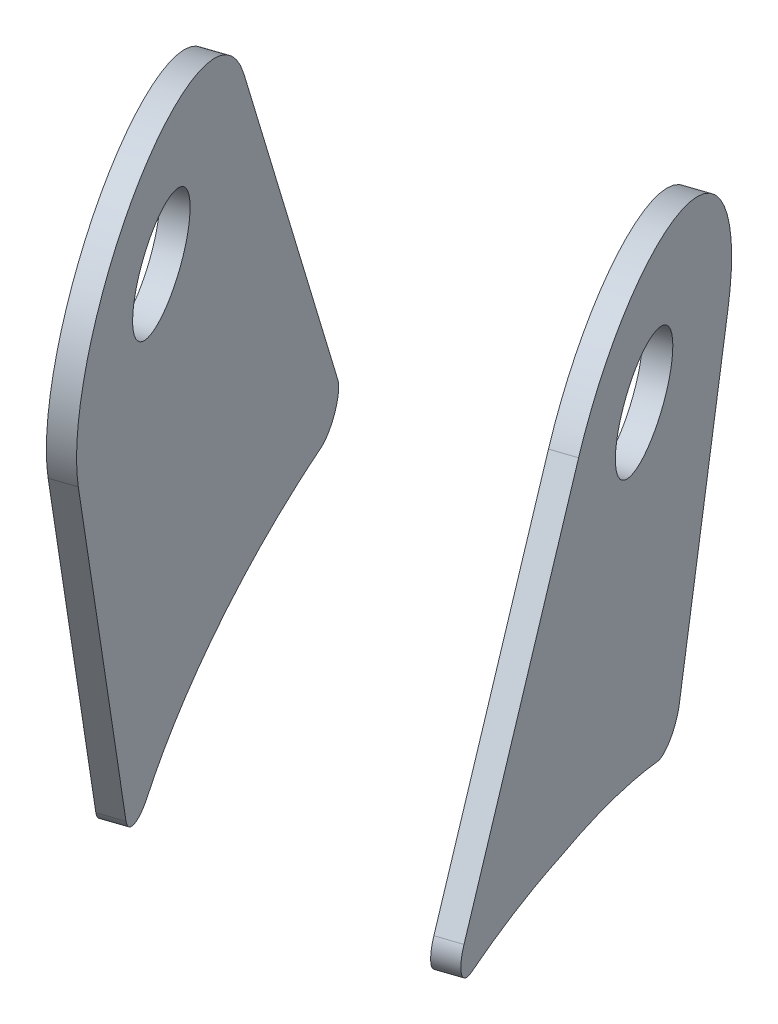
ISO-10303-21;
HEADER;
FILE_DESCRIPTION(('STEP AP214'),'2;1');
FILE_NAME('part.step','',(''),(''),'','','');
FILE_SCHEMA(('AUTOMOTIVE_DESIGN { 1 0 10303 214 1 1 1 1 }'));
ENDSEC;
DATA;
#1=APPLICATION_CONTEXT('core data for automotive mechanical design processes');
#2=APPLICATION_PROTOCOL_DEFINITION('international standard','automotive_design',2000,#1);
#3=PRODUCT_CONTEXT('',#1,'mechanical');
#4=PRODUCT('Part','Part','',(#3));
#5=PRODUCT_RELATED_PRODUCT_CATEGORY('part','',(#4));
#6=PRODUCT_DEFINITION_FORMATION('','',#4);
#7=PRODUCT_DEFINITION_CONTEXT('part definition',#1,'design');
#8=PRODUCT_DEFINITION('design','',#6,#7);
#9=PRODUCT_DEFINITION_SHAPE('','',#8);
#10=(LENGTH_UNIT() NAMED_UNIT(*) SI_UNIT(.MILLI.,.METRE.));
#11=(NAMED_UNIT(*) PLANE_ANGLE_UNIT() SI_UNIT($,.RADIAN.));
#12=(NAMED_UNIT(*) SI_UNIT($,.STERADIAN.) SOLID_ANGLE_UNIT());
#13=UNCERTAINTY_MEASURE_WITH_UNIT(LENGTH_MEASURE(1.E-05),#10,'distance_accuracy_value','');
#14=(GEOMETRIC_REPRESENTATION_CONTEXT(3) GLOBAL_UNCERTAINTY_ASSIGNED_CONTEXT((#13)) GLOBAL_UNIT_ASSIGNED_CONTEXT((#10,
#11,#12)) REPRESENTATION_CONTEXT('',''));
#15=CARTESIAN_POINT('',(0.,0.,0.));
#16=DIRECTION('',(0.,0.,1.));
#17=DIRECTION('',(1.,0.,0.));
#18=AXIS2_PLACEMENT_3D('',#15,#16,#17);
#19=CARTESIAN_POINT('',(1315.91198853962,177.013000299117,-496.611994585862));
#20=DIRECTION('',(-0.31307025087173,0.530600499071286,-0.787686567363196));
#21=DIRECTION('',(0.,0.829379498727392,0.558685642459782));
#22=AXIS2_PLACEMENT_3D('',#19,#20,#21);
#23=PLANE('',#22);
#24=DIRECTION('',(0.286551754259209,0.843500847863434,0.454306517435792));
#25=VECTOR('',#24,1.);
#26=CARTESIAN_POINT('',(1317.06193487105,176.906976746498,-497.140466383718));
#27=LINE('',#26,#25);
#28=CARTESIAN_POINT('',(1322.78996053934,193.768135109614,-488.059107241894));
#29=VERTEX_POINT('',#28);
#30=CARTESIAN_POINT('',(1331.70769155631,220.01858921439,-473.920707244246));
#31=VERTEX_POINT('',#30);
#32=EDGE_CURVE('E126',#29,#31,#27,.T.);
#33=ORIENTED_EDGE('',*,*,#32,.F.);
#34=DIRECTION('',(-0.905469552304262,0.083483112298055,0.416119525870812));
#35=VECTOR('',#34,1.);
#36=CARTESIAN_POINT('',(1321.64001420792,193.874158662233,-487.530635444039));
#37=LINE('',#36,#35);
#38=CARTESIAN_POINT('',(1321.64001420792,193.874158662233,-487.530635444039));
#39=VERTEX_POINT('',#38);
#40=EDGE_CURVE('E138',#29,#39,#37,.T.);
#41=ORIENTED_EDGE('',*,*,#40,.T.);
#42=DIRECTION('',(0.286551754259209,0.843500847863434,0.454306517435792));
#43=VECTOR('',#42,1.);
#44=CARTESIAN_POINT('',(1315.91198853962,177.013000299117,-496.611994585862));
#45=LINE('',#44,#43);
#46=CARTESIAN_POINT('',(1330.55774522488,220.124612767009,-473.39223544639));
#47=VERTEX_POINT('',#46);
#48=EDGE_CURVE('E113',#39,#47,#45,.T.);
#49=ORIENTED_EDGE('',*,*,#48,.T.);
#50=DIRECTION('',(0.905469552304262,-0.0834831122980549,-0.416119525870812));
#51=VECTOR('',#50,1.);
#52=CARTESIAN_POINT('',(1330.55774522488,220.124612767009,-473.39223544639));
#53=LINE('',#52,#51);
#54=EDGE_CURVE('E112',#47,#31,#53,.T.);
#55=ORIENTED_EDGE('',*,*,#54,.T.);
#56=EDGE_LOOP('',(#33,#41,#49,#55));
#57=FACE_BOUND('',#56,.T.);
#58=ADVANCED_FACE('F51',(#57),#23,.T.);
#59=CARTESIAN_POINT('',(1329.38625114849,183.005525752072,-468.49444871424));
#60=DIRECTION('',(0.349198147405529,-0.410707466315973,0.842247013031723));
#61=DIRECTION('',(0.,-0.898829300013332,-0.438298858585719));
#62=AXIS2_PLACEMENT_3D('',#59,#60,#61);
#63=PLANE('',#62);
#64=DIRECTION('',(-0.241216798126639,-0.907937193352791,-0.342730957499012));
#65=VECTOR('',#64,1.);
#66=CARTESIAN_POINT('',(1329.38625114849,183.005525752072,-468.49444871424));
#67=LINE('',#66,#65);
#68=CARTESIAN_POINT('',(1336.86585171847,211.158654396695,-457.867118093128));
#69=VERTEX_POINT('',#68);
#70=CARTESIAN_POINT('',(1330.55591561826,187.408129070302,-466.832540311553));
#71=VERTEX_POINT('',#70);
#72=EDGE_CURVE('E106',#69,#71,#67,.T.);
#73=ORIENTED_EDGE('',*,*,#72,.T.);
#74=DIRECTION('',(-0.905469552304262,0.083483112298055,0.416119525870812));
#75=VECTOR('',#74,1.);
#76=CARTESIAN_POINT('',(1330.55591561826,187.408129070302,-466.832540311553));
#77=LINE('',#76,#75);
#78=CARTESIAN_POINT('',(1331.70586194969,187.302105517683,-467.361012109409));
#79=VERTEX_POINT('',#78);
#80=EDGE_CURVE('E12',#71,#79,#77,.F.);
#81=ORIENTED_EDGE('',*,*,#80,.T.);
#82=DIRECTION('',(-0.241216798126639,-0.907937193352791,-0.342730957499012));
#83=VECTOR('',#82,1.);
#84=CARTESIAN_POINT('',(1330.53619747992,182.899502199454,-469.022920512096));
#85=LINE('',#84,#83);
#86=CARTESIAN_POINT('',(1338.0157980499,211.052630844077,-458.395589890984));
#87=VERTEX_POINT('',#86);
#88=EDGE_CURVE('E107',#87,#79,#85,.T.);
#89=ORIENTED_EDGE('',*,*,#88,.F.);
#90=DIRECTION('',(0.905469552304262,-0.0834831122980549,-0.416119525870812));
#91=VECTOR('',#90,1.);
#92=CARTESIAN_POINT('',(1336.86585171847,211.158654396695,-457.867118093128));
#93=LINE('',#92,#91);
#94=EDGE_CURVE('E103',#69,#87,#93,.T.);
#95=ORIENTED_EDGE('',*,*,#94,.F.);
#96=EDGE_LOOP('',(#73,#81,#89,#95));
#97=FACE_BOUND('',#96,.T.);
#98=ADVANCED_FACE('F105',(#97),#63,.T.);
#99=CARTESIAN_POINT('',(1333.53973936443,215.070643013355,-465.889520892256));
#100=DIRECTION('',(-0.905469552304262,0.083483112298055,0.416119525870812));
#101=DIRECTION('',(0.417577207681798,0.,0.908641445029156));
#102=AXIS2_PLACEMENT_3D('',#99,#100,#101);
#103=PLANE('',#102);
#104=CARTESIAN_POINT('',(1333.86054144698,216.573994912941,-465.493067439949));
#105=DIRECTION('',(0.905469552304262,-0.083483112298055,-0.416119525870812));
#106=DIRECTION('',(-0.417577207681798,0.,-0.908641445029156));
#107=AXIS2_PLACEMENT_3D('',#104,#105,#106);
#108=CIRCLE('',#107,3.1750000000001);
#109=CARTESIAN_POINT('',(1332.53473381259,216.573994912941,-468.378004027917));
#110=VERTEX_POINT('',#109);
#111=EDGE_CURVE('E136',#110,#110,#108,.T.);
#112=ORIENTED_EDGE('',*,*,#111,.T.);
#113=EDGE_LOOP('',(#112));
#114=FACE_BOUND('',#113,.T.);
#115=ORIENTED_EDGE('',*,*,#48,.F.);
#116=CARTESIAN_POINT('',(1322.13701323118,193.031830369957,-486.280183018349));
#117=DIRECTION('',(-0.905469552304262,0.083483112298055,0.416119525870812));
#118=DIRECTION('',(0.417577207681798,0.,0.908641445029156));
#119=AXIS2_PLACEMENT_3D('',#116,#117,#118);
#120=CIRCLE('',#119,1.5875);
#121=CARTESIAN_POINT('',(1322.03720766495,191.450632950807,-486.18013392729));
#122=VERTEX_POINT('',#121);
#123=EDGE_CURVE('E143',#39,#122,#120,.T.);
#124=ORIENTED_EDGE('',*,*,#123,.T.);
#125=CARTESIAN_POINT('',(1317.99053268235,177.937409229088,-492.274572793221));
#126=DIRECTION('',(-0.905469552304262,0.083483112298055,0.416119525870812));
#127=DIRECTION('',(-0.424386223901574,-0.188740959148202,-0.885591995956591));
#128=AXIS2_PLACEMENT_3D('',#125,#126,#127);
#129=ELLIPSE('',#128,28.4779023788006,12.7);
#130=CARTESIAN_POINT('',(1329.46211870526,186.901216929926,-469.110927022683));
#131=VERTEX_POINT('',#130);
#132=EDGE_CURVE('E159',#131,#122,#129,.T.);
#133=ORIENTED_EDGE('',*,*,#132,.F.);
#134=CARTESIAN_POINT('',(1330.00156355926,188.060127173078,-468.169607444741));
#135=DIRECTION('',(-0.905469552304262,0.083483112298055,0.416119525870812));
#136=DIRECTION('',(0.417577207681798,0.,0.908641445029156));
#137=AXIS2_PLACEMENT_3D('',#134,#135,#136);
#138=CIRCLE('',#137,1.5875);
#139=EDGE_CURVE('E121',#131,#71,#138,.T.);
#140=ORIENTED_EDGE('',*,*,#139,.T.);
#141=ORIENTED_EDGE('',*,*,#72,.F.);
#142=CARTESIAN_POINT('',(1333.53973936443,215.070643013355,-465.889520892256));
#143=DIRECTION('',(0.905469552304262,-0.083483112298055,-0.416119525870812));
#144=DIRECTION('',(0.417577207681798,0.,0.908641445029156));
#145=AXIS2_PLACEMENT_3D('',#142,#143,#144);
#146=CIRCLE('',#145,9.52500000000001);
#147=EDGE_CURVE('E119',#47,#69,#146,.T.);
#148=ORIENTED_EDGE('',*,*,#147,.F.);
#149=EDGE_LOOP('',(#115,#124,#133,#140,#141,#148));
#150=FACE_BOUND('',#149,.T.);
#151=ADVANCED_FACE('F118',(#114,#150),#103,.T.);
#152=CARTESIAN_POINT('',(1334.68968569586,214.964619460736,-466.417992690112));
#153=DIRECTION('',(-0.905469552304262,0.083483112298055,0.416119525870812));
#154=DIRECTION('',(0.417577207681798,0.,0.908641445029156));
#155=AXIS2_PLACEMENT_3D('',#152,#153,#154);
#156=PLANE('',#155);
#157=CARTESIAN_POINT('',(1335.0104877784,216.467971360322,-466.021539237805));
#158=DIRECTION('',(0.905469552304262,-0.083483112298055,-0.416119525870812));
#159=DIRECTION('',(-0.417577207681798,0.,-0.908641445029156));
#160=AXIS2_PLACEMENT_3D('',#157,#158,#159);
#161=CIRCLE('',#160,3.1750000000001);
#162=CARTESIAN_POINT('',(1333.68468014401,216.467971360322,-468.906475825773));
#163=VERTEX_POINT('',#162);
#164=EDGE_CURVE('E130',#163,#163,#161,.T.);
#165=ORIENTED_EDGE('',*,*,#164,.F.);
#166=EDGE_LOOP('',(#165));
#167=FACE_BOUND('',#166,.T.);
#168=CARTESIAN_POINT('',(1319.14047901378,177.83138567647,-492.803044591077));
#169=DIRECTION('',(-0.905469552304262,0.083483112298055,0.416119525870812));
#170=DIRECTION('',(-0.424386223901574,-0.188740959148202,-0.885591995956591));
#171=AXIS2_PLACEMENT_3D('',#168,#169,#170);
#172=ELLIPSE('',#171,28.4779023788006,12.7);
#173=CARTESIAN_POINT('',(1330.61206503669,186.795193377308,-469.639398820539));
#174=VERTEX_POINT('',#173);
#175=CARTESIAN_POINT('',(1323.18715399637,191.344609398188,-486.708605725146));
#176=VERTEX_POINT('',#175);
#177=EDGE_CURVE('E154',#174,#176,#172,.T.);
#178=ORIENTED_EDGE('',*,*,#177,.T.);
#179=CARTESIAN_POINT('',(1323.2869595626,192.925806817338,-486.808654816205));
#180=DIRECTION('',(-0.905469552304262,0.083483112298055,0.416119525870812));
#181=DIRECTION('',(0.417577207681798,0.,0.908641445029156));
#182=AXIS2_PLACEMENT_3D('',#179,#180,#181);
#183=CIRCLE('',#182,1.5875);
#184=EDGE_CURVE('E59',#176,#29,#183,.F.);
#185=ORIENTED_EDGE('',*,*,#184,.T.);
#186=ORIENTED_EDGE('',*,*,#32,.T.);
#187=CARTESIAN_POINT('',(1334.68968569586,214.964619460736,-466.417992690112));
#188=DIRECTION('',(0.905469552304262,-0.083483112298055,-0.416119525870812));
#189=DIRECTION('',(0.417577207681798,0.,0.908641445029156));
#190=AXIS2_PLACEMENT_3D('',#187,#188,#189);
#191=CIRCLE('',#190,9.52500000000001);
#192=EDGE_CURVE('E134',#31,#87,#191,.T.);
#193=ORIENTED_EDGE('',*,*,#192,.T.);
#194=ORIENTED_EDGE('',*,*,#88,.T.);
#195=CARTESIAN_POINT('',(1331.15150989068,187.95410362046,-468.698079242597));
#196=DIRECTION('',(-0.905469552304262,0.083483112298055,0.416119525870812));
#197=DIRECTION('',(0.417577207681798,0.,0.908641445029156));
#198=AXIS2_PLACEMENT_3D('',#195,#196,#197);
#199=CIRCLE('',#198,1.5875);
#200=EDGE_CURVE('E149',#79,#174,#199,.F.);
#201=ORIENTED_EDGE('',*,*,#200,.T.);
#202=EDGE_LOOP('',(#178,#185,#186,#193,#194,#201));
#203=FACE_BOUND('',#202,.T.);
#204=ADVANCED_FACE('F153',(#167,#203),#156,.F.);
#205=CARTESIAN_POINT('',(1333.53973936443,215.070643013355,-465.889520892256));
#206=DIRECTION('',(0.905469552304262,-0.0834831122980549,-0.416119525870812));
#207=DIRECTION('',(-0.417577207681798,0.,-0.908641445029156));
#208=AXIS2_PLACEMENT_3D('',#205,#206,#207);
#209=CYLINDRICAL_SURFACE('',#208,9.52500000000001);
#210=ORIENTED_EDGE('',*,*,#192,.F.);
#211=ORIENTED_EDGE('',*,*,#54,.F.);
#212=ORIENTED_EDGE('',*,*,#147,.T.);
#213=ORIENTED_EDGE('',*,*,#94,.T.);
#214=EDGE_LOOP('',(#210,#211,#212,#213));
#215=FACE_BOUND('',#214,.T.);
#216=ADVANCED_FACE('F124',(#215),#209,.T.);
#217=CARTESIAN_POINT('',(1333.86054144698,216.573994912941,-465.493067439949));
#218=DIRECTION('',(0.905469552304262,-0.0834831122980549,-0.416119525870812));
#219=DIRECTION('',(-0.417577207681798,0.,-0.908641445029156));
#220=AXIS2_PLACEMENT_3D('',#217,#218,#219);
#221=CYLINDRICAL_SURFACE('',#220,3.1750000000001);
#222=ORIENTED_EDGE('',*,*,#111,.F.);
#223=EDGE_LOOP('',(#222));
#224=FACE_BOUND('',#223,.T.);
#225=ORIENTED_EDGE('',*,*,#164,.T.);
#226=EDGE_LOOP('',(#225));
#227=FACE_BOUND('',#226,.T.);
#228=ADVANCED_FACE('F170',(#224,#227),#221,.F.);
#229=CARTESIAN_POINT('',(1319.14047901378,177.83138567647,-492.803044591077));
#230=DIRECTION('',(-0.905469552304262,0.083483112298055,0.416119525870812));
#231=DIRECTION('',(-0.424386223901574,-0.188740959148202,-0.885591995956591));
#232=AXIS2_PLACEMENT_3D('',#229,#230,#231);
#233=ELLIPSE('',#232,28.4779023788006,12.7);
#234=DIRECTION('',(-0.905469552304262,0.083483112298055,0.416119525870812));
#235=VECTOR('',#234,1.);
#236=SURFACE_OF_LINEAR_EXTRUSION('',#233,#235);
#237=ORIENTED_EDGE('',*,*,#132,.T.);
#238=DIRECTION('',(-0.905469552304262,0.083483112298055,0.416119525870812));
#239=VECTOR('',#238,1.);
#240=CARTESIAN_POINT('',(1322.03720766495,191.450632950807,-486.18013392729));
#241=LINE('',#240,#239);
#242=EDGE_CURVE('E72',#122,#176,#241,.F.);
#243=ORIENTED_EDGE('',*,*,#242,.T.);
#244=ORIENTED_EDGE('',*,*,#177,.F.);
#245=DIRECTION('',(-0.905469552304262,0.083483112298055,0.416119525870812));
#246=VECTOR('',#245,1.);
#247=CARTESIAN_POINT('',(1330.61206503669,186.795193377308,-469.639398820539));
#248=LINE('',#247,#246);
#249=EDGE_CURVE('E145',#174,#131,#248,.T.);
#250=ORIENTED_EDGE('',*,*,#249,.T.);
#251=EDGE_LOOP('',(#237,#243,#244,#250));
#252=FACE_BOUND('',#251,.T.);
#253=ADVANCED_FACE('F160',(#252),#236,.F.);
#254=CARTESIAN_POINT('',(1322.71198639689,192.978818593648,-486.544418917277));
#255=DIRECTION('',(-0.905469552304262,0.083483112298055,0.416119525870812));
#256=DIRECTION('',(0.417577207681798,0.,0.908641445029156));
#257=AXIS2_PLACEMENT_3D('',#254,#255,#256);
#258=CYLINDRICAL_SURFACE('',#257,1.5875);
#259=ORIENTED_EDGE('',*,*,#184,.F.);
#260=ORIENTED_EDGE('',*,*,#242,.F.);
#261=ORIENTED_EDGE('',*,*,#123,.F.);
#262=ORIENTED_EDGE('',*,*,#40,.F.);
#263=EDGE_LOOP('',(#259,#260,#261,#262));
#264=FACE_BOUND('',#263,.T.);
#265=ADVANCED_FACE('F158',(#264),#258,.T.);
#266=CARTESIAN_POINT('',(1330.57653672497,188.007115396769,-468.433843343669));
#267=DIRECTION('',(-0.905469552304262,0.083483112298055,0.416119525870812));
#268=DIRECTION('',(0.417577207681798,0.,0.908641445029156));
#269=AXIS2_PLACEMENT_3D('',#266,#267,#268);
#270=CYLINDRICAL_SURFACE('',#269,1.5875);
#271=ORIENTED_EDGE('',*,*,#200,.F.);
#272=ORIENTED_EDGE('',*,*,#80,.F.);
#273=ORIENTED_EDGE('',*,*,#139,.F.);
#274=ORIENTED_EDGE('',*,*,#249,.F.);
#275=EDGE_LOOP('',(#271,#272,#273,#274));
#276=FACE_BOUND('',#275,.T.);
#277=ADVANCED_FACE('F53',(#276),#270,.T.);
#278=CLOSED_SHELL('',(#58,#98,#151,#204,#216,#228,#253,#265,#277));
#279=MANIFOLD_SOLID_BREP('B2',#278);
#280=CARTESIAN_POINT('',(1349.07018245253,212.595197620884,-483.483020617896));
#281=DIRECTION('',(0.421904939227984,0.0706608921737899,0.90388232672856));
#282=DIRECTION('',(0.906147337010236,0.,-0.422962177539857));
#283=AXIS2_PLACEMENT_3D('',#280,#281,#282);
#284=PLANE('',#283);
#285=DIRECTION('',(0.0460555328375425,0.994000808992746,-0.0992032238226956));
#286=VECTOR('',#285,1.);
#287=CARTESIAN_POINT('',(1349.07018245253,212.595197620884,-483.483020617896));
#288=LINE('',#287,#286);
#289=CARTESIAN_POINT('',(1348.21184254041,194.069940947574,-481.634163788496));
#290=VERTEX_POINT('',#289);
#291=CARTESIAN_POINT('',(1349.07018245253,212.595197620884,-483.483020617896));
#292=VERTEX_POINT('',#291);
#293=EDGE_CURVE('E369',#290,#292,#288,.T.);
#294=ORIENTED_EDGE('',*,*,#293,.F.);
#295=DIRECTION('',(0.905469552304262,-0.0834831122980549,-0.416119525870812));
#296=VECTOR('',#295,1.);
#297=CARTESIAN_POINT('',(1347.06189620898,194.175964500192,-481.10569199064));
#298=LINE('',#297,#296);
#299=CARTESIAN_POINT('',(1347.06189620898,194.175964500192,-481.10569199064));
#300=VERTEX_POINT('',#299);
#301=EDGE_CURVE('E49',#290,#300,#298,.F.);
#302=ORIENTED_EDGE('',*,*,#301,.T.);
#303=DIRECTION('',(0.0460555328375425,0.994000808992746,-0.0992032238226956));
#304=VECTOR('',#303,1.);
#305=CARTESIAN_POINT('',(1347.92023612111,212.701221173503,-482.95454882004));
#306=LINE('',#305,#304);
#307=CARTESIAN_POINT('',(1347.92023612111,212.701221173503,-482.95454882004));
#308=VERTEX_POINT('',#307);
#309=EDGE_CURVE('E366',#300,#308,#306,.T.);
#310=ORIENTED_EDGE('',*,*,#309,.T.);
#311=DIRECTION('',(-0.905469552304262,0.0834831122980549,0.416119525870812));
#312=VECTOR('',#311,1.);
#313=CARTESIAN_POINT('',(1349.07018245253,212.595197620884,-483.483020617896));
#314=LINE('',#313,#312);
#315=EDGE_CURVE('E385',#292,#308,#314,.T.);
#316=ORIENTED_EDGE('',*,*,#315,.F.);
#317=EDGE_LOOP('',(#294,#302,#310,#316));
#318=FACE_BOUND('',#317,.T.);
#319=ADVANCED_FACE('F264',(#318),#284,.F.);
#320=CARTESIAN_POINT('',(1361.06217513073,186.596398265217,-452.172677993332));
#321=DIRECTION('',(-0.407647260300071,-0.443914751090842,-0.797974564089484));
#322=DIRECTION('',(0.,0.873880257042931,-0.486141230868748));
#323=AXIS2_PLACEMENT_3D('',#320,#321,#322);
#324=PLANE('',#323);
#325=DIRECTION('',(0.118104195606108,-0.892171655974895,0.435982952941108));
#326=VECTOR('',#325,1.);
#327=CARTESIAN_POINT('',(1359.9122287993,186.702421817836,-451.644206195476));
#328=LINE('',#327,#326);
#329=CARTESIAN_POINT('',(1355.82172082161,217.602554175599,-466.744361934998));
#330=VERTEX_POINT('',#329);
#331=CARTESIAN_POINT('',(1358.19017999836,199.710961629034,-458.00116851585));
#332=VERTEX_POINT('',#331);
#333=EDGE_CURVE('E372',#330,#332,#328,.T.);
#334=ORIENTED_EDGE('',*,*,#333,.T.);
#335=DIRECTION('',(0.905469552304262,-0.0834831122980549,-0.416119525870812));
#336=VECTOR('',#335,1.);
#337=CARTESIAN_POINT('',(1359.34012632978,199.604938076416,-458.529640313706));
#338=LINE('',#337,#336);
#339=CARTESIAN_POINT('',(1359.34012632978,199.604938076416,-458.529640313706));
#340=VERTEX_POINT('',#339);
#341=EDGE_CURVE('E392',#332,#340,#338,.T.);
#342=ORIENTED_EDGE('',*,*,#341,.T.);
#343=DIRECTION('',(0.118104195606108,-0.892171655974895,0.435982952941108));
#344=VECTOR('',#343,1.);
#345=CARTESIAN_POINT('',(1361.06217513073,186.596398265217,-452.172677993332));
#346=LINE('',#345,#344);
#347=CARTESIAN_POINT('',(1356.97166715304,217.49653062298,-467.272833732854));
#348=VERTEX_POINT('',#347);
#349=EDGE_CURVE('E374',#348,#340,#346,.T.);
#350=ORIENTED_EDGE('',*,*,#349,.F.);
#351=DIRECTION('',(-0.905469552304262,0.0834831122980549,0.416119525870812));
#352=VECTOR('',#351,1.);
#353=CARTESIAN_POINT('',(1356.97166715304,217.49653062298,-467.272833732854));
#354=LINE('',#353,#352);
#355=EDGE_CURVE('E377',#348,#330,#354,.T.);
#356=ORIENTED_EDGE('',*,*,#355,.T.);
#357=EDGE_LOOP('',(#334,#342,#350,#356));
#358=FACE_BOUND('',#357,.T.);
#359=ADVANCED_FACE('F404',(#358),#324,.F.);
#360=CARTESIAN_POINT('',(1353.08882699868,213.26824261884,-474.873541455806));
#361=DIRECTION('',(-0.905469552304262,0.083483112298055,0.416119525870812));
#362=DIRECTION('',(0.417577207681798,0.,0.908641445029156));
#363=AXIS2_PLACEMENT_3D('',#360,#361,#362);
#364=PLANE('',#363);
#365=ORIENTED_EDGE('',*,*,#349,.T.);
#366=CARTESIAN_POINT('',(1358.69298630406,198.900223409059,-459.796424934198));
#367=DIRECTION('',(-0.905469552304262,0.083483112298055,0.416119525870812));
#368=DIRECTION('',(0.417577207681798,0.,0.908641445029156));
#369=AXIS2_PLACEMENT_3D('',#366,#367,#368);
#370=CIRCLE('',#369,1.5875);
#371=CARTESIAN_POINT('',(1358.60149910664,197.319760881468,-459.678422639344));
#372=VERTEX_POINT('',#371);
#373=EDGE_CURVE('E395',#340,#372,#370,.F.);
#374=ORIENTED_EDGE('',*,*,#373,.T.);
#375=CARTESIAN_POINT('',(1354.84726626603,183.832388045096,-465.141698277685));
#376=DIRECTION('',(-0.905469552304262,0.083483112298055,0.416119525870812));
#377=DIRECTION('',(-0.424386223901574,-0.188740959148202,-0.885591995956591));
#378=AXIS2_PLACEMENT_3D('',#375,#376,#377);
#379=ELLIPSE('',#378,28.4779023788006,12.7);
#380=CARTESIAN_POINT('',(1354.24795430374,196.005988895019,-468.888094983656));
#381=VERTEX_POINT('',#380);
#382=EDGE_CURVE('E334',#372,#381,#379,.T.);
#383=ORIENTED_EDGE('',*,*,#382,.T.);
#384=CARTESIAN_POINT('',(1353.76553839419,183.351301844438,-467.399004220128));
#385=DIRECTION('',(-0.905469552304262,0.083483112298055,0.416119525870812));
#386=DIRECTION('',(-0.424386223901574,-0.188740959148202,-0.885591995956591));
#387=AXIS2_PLACEMENT_3D('',#384,#385,#386);
#388=ELLIPSE('',#387,28.4779023788006,12.7);
#389=CARTESIAN_POINT('',(1349.01338709623,192.710987222612,-479.617378167143));
#390=VERTEX_POINT('',#389);
#391=EDGE_CURVE('E340',#381,#390,#388,.T.);
#392=ORIENTED_EDGE('',*,*,#391,.T.);
#393=CARTESIAN_POINT('',(1348.88161663144,194.1821151139,-480.199250594814));
#394=DIRECTION('',(-0.905469552304262,0.083483112298055,0.416119525870812));
#395=DIRECTION('',(0.417577207681798,0.,0.908641445029156));
#396=AXIS2_PLACEMENT_3D('',#393,#394,#395);
#397=CIRCLE('',#396,1.5875);
#398=EDGE_CURVE('E279',#390,#290,#397,.F.);
#399=ORIENTED_EDGE('',*,*,#398,.T.);
#400=ORIENTED_EDGE('',*,*,#293,.T.);
#401=CARTESIAN_POINT('',(1353.08882699868,213.26824261884,-474.873541455806));
#402=DIRECTION('',(0.905469552304262,-0.083483112298055,-0.416119525870812));
#403=DIRECTION('',(0.417577207681798,0.,0.908641445029156));
#404=AXIS2_PLACEMENT_3D('',#401,#402,#403);
#405=CIRCLE('',#404,9.52500000000002);
#406=EDGE_CURVE('E371',#292,#348,#405,.T.);
#407=ORIENTED_EDGE('',*,*,#406,.T.);
#408=EDGE_LOOP('',(#365,#374,#383,#392,#399,#400,#407));
#409=FACE_BOUND('',#408,.T.);
#410=CARTESIAN_POINT('',(1353.40962908123,214.771594518426,-474.4770880035));
#411=DIRECTION('',(0.905469552304262,-0.083483112298055,-0.416119525870812));
#412=DIRECTION('',(-0.417577207681798,0.,-0.908641445029156));
#413=AXIS2_PLACEMENT_3D('',#410,#411,#412);
#414=CIRCLE('',#413,3.1750000000001);
#415=CARTESIAN_POINT('',(1352.08382144684,214.771594518426,-477.362024591468));
#416=VERTEX_POINT('',#415);
#417=EDGE_CURVE('E363',#416,#416,#414,.T.);
#418=ORIENTED_EDGE('',*,*,#417,.F.);
#419=EDGE_LOOP('',(#418));
#420=FACE_BOUND('',#419,.T.);
#421=ADVANCED_FACE('F396',(#409,#420),#364,.F.);
#422=CARTESIAN_POINT('',(1351.93888066725,213.374266171458,-474.345069657951));
#423=DIRECTION('',(-0.905469552304262,0.083483112298055,0.416119525870812));
#424=DIRECTION('',(0.417577207681798,0.,0.908641445029156));
#425=AXIS2_PLACEMENT_3D('',#422,#423,#424);
#426=PLANE('',#425);
#427=CARTESIAN_POINT('',(1353.6973199346,183.938411597715,-464.613226479829));
#428=DIRECTION('',(-0.905469552304262,0.083483112298055,0.416119525870812));
#429=DIRECTION('',(-0.424386223901574,-0.188740959148202,-0.885591995956591));
#430=AXIS2_PLACEMENT_3D('',#427,#428,#429);
#431=ELLIPSE('',#430,28.4779023788006,12.7);
#432=CARTESIAN_POINT('',(1357.45155277521,197.425784434087,-459.149950841488));
#433=VERTEX_POINT('',#432);
#434=CARTESIAN_POINT('',(1353.09800797231,196.112012447637,-468.3596231858));
#435=VERTEX_POINT('',#434);
#436=EDGE_CURVE('E323',#433,#435,#431,.T.);
#437=ORIENTED_EDGE('',*,*,#436,.F.);
#438=CARTESIAN_POINT('',(1357.54303997263,199.006246961677,-459.267953136342));
#439=DIRECTION('',(-0.905469552304262,0.083483112298055,0.416119525870812));
#440=DIRECTION('',(0.417577207681798,0.,0.908641445029156));
#441=AXIS2_PLACEMENT_3D('',#438,#439,#440);
#442=CIRCLE('',#441,1.5875);
#443=EDGE_CURVE('E390',#433,#332,#442,.T.);
#444=ORIENTED_EDGE('',*,*,#443,.T.);
#445=ORIENTED_EDGE('',*,*,#333,.F.);
#446=CARTESIAN_POINT('',(1351.93888066725,213.374266171458,-474.345069657951));
#447=DIRECTION('',(0.905469552304262,-0.083483112298055,-0.416119525870812));
#448=DIRECTION('',(0.417577207681798,0.,0.908641445029156));
#449=AXIS2_PLACEMENT_3D('',#446,#447,#448);
#450=CIRCLE('',#449,9.52500000000002);
#451=EDGE_CURVE('E379',#308,#330,#450,.T.);
#452=ORIENTED_EDGE('',*,*,#451,.F.);
#453=ORIENTED_EDGE('',*,*,#309,.F.);
#454=CARTESIAN_POINT('',(1347.73167030001,194.288138666518,-479.670778796959));
#455=DIRECTION('',(-0.905469552304262,0.083483112298055,0.416119525870812));
#456=DIRECTION('',(0.417577207681798,0.,0.908641445029156));
#457=AXIS2_PLACEMENT_3D('',#454,#455,#456);
#458=CIRCLE('',#457,1.5875);
#459=CARTESIAN_POINT('',(1347.86344076481,192.817010775231,-479.088906369288));
#460=VERTEX_POINT('',#459);
#461=EDGE_CURVE('E346',#300,#460,#458,.T.);
#462=ORIENTED_EDGE('',*,*,#461,.T.);
#463=CARTESIAN_POINT('',(1352.61559206276,183.457325397057,-466.870532422272));
#464=DIRECTION('',(-0.905469552304262,0.083483112298055,0.416119525870812));
#465=DIRECTION('',(-0.424386223901574,-0.188740959148202,-0.885591995956591));
#466=AXIS2_PLACEMENT_3D('',#463,#464,#465);
#467=ELLIPSE('',#466,28.4779023788006,12.7);
#468=EDGE_CURVE('E339',#435,#460,#467,.T.);
#469=ORIENTED_EDGE('',*,*,#468,.F.);
#470=EDGE_LOOP('',(#437,#444,#445,#452,#453,#462,#469));
#471=FACE_BOUND('',#470,.T.);
#472=CARTESIAN_POINT('',(1352.2596827498,214.877618071044,-473.948616205644));
#473=DIRECTION('',(0.905469552304262,-0.083483112298055,-0.416119525870812));
#474=DIRECTION('',(-0.417577207681798,0.,-0.908641445029156));
#475=AXIS2_PLACEMENT_3D('',#472,#473,#474);
#476=CIRCLE('',#475,3.1750000000001);
#477=CARTESIAN_POINT('',(1350.93387511541,214.877618071044,-476.833552793612));
#478=VERTEX_POINT('',#477);
#479=EDGE_CURVE('E333',#478,#478,#476,.T.);
#480=ORIENTED_EDGE('',*,*,#479,.T.);
#481=EDGE_LOOP('',(#480));
#482=FACE_BOUND('',#481,.T.);
#483=ADVANCED_FACE('F342',(#471,#482),#426,.T.);
#484=CARTESIAN_POINT('',(1353.08882699868,213.26824261884,-474.873541455806));
#485=DIRECTION('',(-0.905469552304262,0.0834831122980549,0.416119525870812));
#486=DIRECTION('',(0.417577207681798,0.,0.908641445029156));
#487=AXIS2_PLACEMENT_3D('',#484,#485,#486);
#488=CYLINDRICAL_SURFACE('',#487,9.52500000000002);
#489=ORIENTED_EDGE('',*,*,#451,.T.);
#490=ORIENTED_EDGE('',*,*,#355,.F.);
#491=ORIENTED_EDGE('',*,*,#406,.F.);
#492=ORIENTED_EDGE('',*,*,#315,.T.);
#493=EDGE_LOOP('',(#489,#490,#491,#492));
#494=FACE_BOUND('',#493,.T.);
#495=ADVANCED_FACE('F409',(#494),#488,.T.);
#496=CARTESIAN_POINT('',(1353.40962908123,214.771594518426,-474.4770880035));
#497=DIRECTION('',(-0.905469552304262,0.0834831122980549,0.416119525870812));
#498=DIRECTION('',(0.417577207681798,0.,0.908641445029156));
#499=AXIS2_PLACEMENT_3D('',#496,#497,#498);
#500=CYLINDRICAL_SURFACE('',#499,3.1750000000001);
#501=ORIENTED_EDGE('',*,*,#417,.T.);
#502=EDGE_LOOP('',(#501));
#503=FACE_BOUND('',#502,.T.);
#504=ORIENTED_EDGE('',*,*,#479,.F.);
#505=EDGE_LOOP('',(#504));
#506=FACE_BOUND('',#505,.T.);
#507=ADVANCED_FACE('F358',(#503,#506),#500,.F.);
#508=CARTESIAN_POINT('',(1354.84726626603,183.832388045096,-465.141698277685));
#509=DIRECTION('',(-0.905469552304262,0.083483112298055,0.416119525870812));
#510=DIRECTION('',(-0.424386223901574,-0.188740959148202,-0.885591995956591));
#511=AXIS2_PLACEMENT_3D('',#508,#509,#510);
#512=ELLIPSE('',#511,28.4779023788006,12.7);
#513=DIRECTION('',(-0.905469552304262,0.083483112298055,0.416119525870812));
#514=VECTOR('',#513,1.);
#515=SURFACE_OF_LINEAR_EXTRUSION('',#512,#514);
#516=ORIENTED_EDGE('',*,*,#382,.F.);
#517=DIRECTION('',(-0.905469552304262,0.083483112298055,0.416119525870812));
#518=VECTOR('',#517,1.);
#519=CARTESIAN_POINT('',(1358.60149910664,197.319760881468,-459.678422639344));
#520=LINE('',#519,#518);
#521=EDGE_CURVE('E330',#372,#433,#520,.T.);
#522=ORIENTED_EDGE('',*,*,#521,.T.);
#523=ORIENTED_EDGE('',*,*,#436,.T.);
#524=DIRECTION('',(-0.905469552304262,0.083483112298055,0.416119525870812));
#525=VECTOR('',#524,1.);
#526=CARTESIAN_POINT('',(1353.09800797231,196.112012447636,-468.359623185807));
#527=LINE('',#526,#525);
#528=EDGE_CURVE('E327',#435,#381,#527,.F.);
#529=ORIENTED_EDGE('',*,*,#528,.T.);
#530=EDGE_LOOP('',(#516,#522,#523,#529));
#531=FACE_BOUND('',#530,.T.);
#532=ADVANCED_FACE('F326',(#531),#515,.F.);
#533=CARTESIAN_POINT('',(1352.61559206276,183.457325397057,-466.870532422272));
#534=DIRECTION('',(-0.905469552304262,0.083483112298055,0.416119525870812));
#535=DIRECTION('',(-0.424386223901574,-0.188740959148202,-0.885591995956591));
#536=AXIS2_PLACEMENT_3D('',#533,#534,#535);
#537=ELLIPSE('',#536,28.4779023788006,12.7);
#538=DIRECTION('',(-0.905469552304262,0.083483112298055,0.416119525870812));
#539=VECTOR('',#538,1.);
#540=SURFACE_OF_LINEAR_EXTRUSION('',#537,#539);
#541=ORIENTED_EDGE('',*,*,#468,.T.);
#542=DIRECTION('',(-0.905469552304262,0.083483112298055,0.416119525870812));
#543=VECTOR('',#542,1.);
#544=CARTESIAN_POINT('',(1347.86344076481,192.817010775231,-479.088906369288));
#545=LINE('',#544,#543);
#546=EDGE_CURVE('E272',#460,#390,#545,.F.);
#547=ORIENTED_EDGE('',*,*,#546,.T.);
#548=ORIENTED_EDGE('',*,*,#391,.F.);
#549=ORIENTED_EDGE('',*,*,#528,.F.);
#550=EDGE_LOOP('',(#541,#547,#548,#549));
#551=FACE_BOUND('',#550,.T.);
#552=ADVANCED_FACE('F338',(#551),#540,.F.);
#553=CARTESIAN_POINT('',(1358.11801313834,198.953235185368,-459.53218903527));
#554=DIRECTION('',(-0.905469552304262,0.083483112298055,0.416119525870812));
#555=DIRECTION('',(0.417577207681798,0.,0.908641445029156));
#556=AXIS2_PLACEMENT_3D('',#553,#554,#555);
#557=CYLINDRICAL_SURFACE('',#556,1.5875);
#558=ORIENTED_EDGE('',*,*,#373,.F.);
#559=ORIENTED_EDGE('',*,*,#341,.F.);
#560=ORIENTED_EDGE('',*,*,#443,.F.);
#561=ORIENTED_EDGE('',*,*,#521,.F.);
#562=EDGE_LOOP('',(#558,#559,#560,#561));
#563=FACE_BOUND('',#562,.T.);
#564=ADVANCED_FACE('F354',(#563),#557,.T.);
#565=CARTESIAN_POINT('',(1348.30664346572,194.235126890209,-479.935014695886));
#566=DIRECTION('',(-0.905469552304262,0.083483112298055,0.416119525870812));
#567=DIRECTION('',(0.417577207681798,0.,0.908641445029156));
#568=AXIS2_PLACEMENT_3D('',#565,#566,#567);
#569=CYLINDRICAL_SURFACE('',#568,1.5875);
#570=ORIENTED_EDGE('',*,*,#461,.F.);
#571=ORIENTED_EDGE('',*,*,#301,.F.);
#572=ORIENTED_EDGE('',*,*,#398,.F.);
#573=ORIENTED_EDGE('',*,*,#546,.F.);
#574=EDGE_LOOP('',(#570,#571,#572,#573));
#575=FACE_BOUND('',#574,.T.);
#576=ADVANCED_FACE('F266',(#575),#569,.T.);
#577=CLOSED_SHELL('',(#319,#359,#421,#483,#495,#507,#532,#552,#564,#576));
#578=MANIFOLD_SOLID_BREP('B6',#577);
#579=ADVANCED_BREP_SHAPE_REPRESENTATION('',(#18,#279,#578),#14);
#580=SHAPE_DEFINITION_REPRESENTATION(#9,#579);
ENDSEC;
END-ISO-10303-21;
